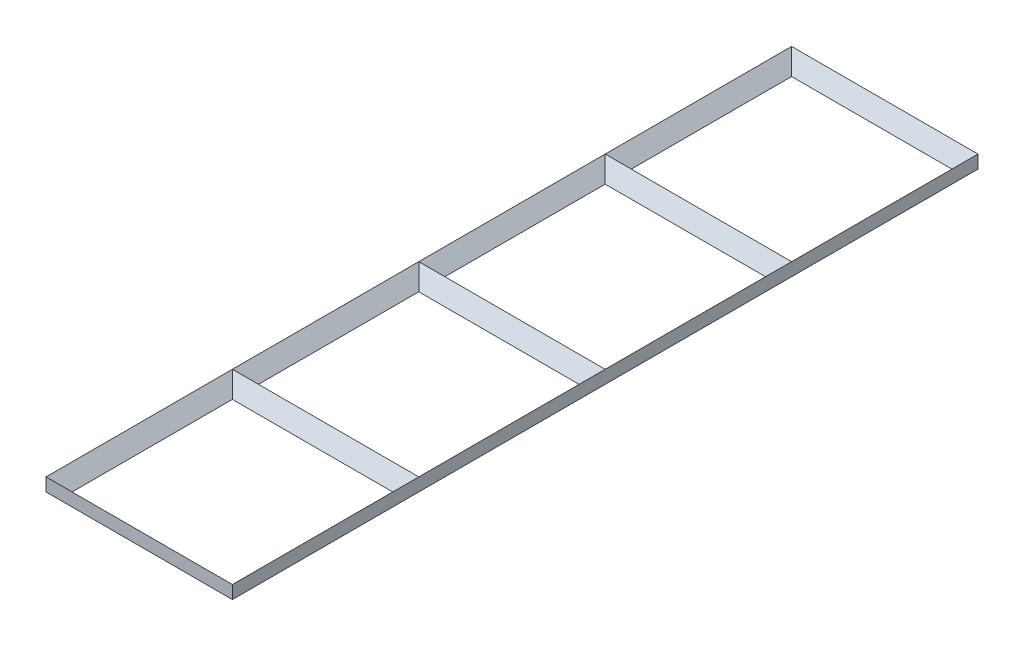
ISO-10303-21;
HEADER;
FILE_DESCRIPTION(('STEP AP214'),'2;1');
FILE_NAME('part.step','',(''),(''),'','','');
FILE_SCHEMA(('AUTOMOTIVE_DESIGN { 1 0 10303 214 1 1 1 1 }'));
ENDSEC;
DATA;
#1=APPLICATION_CONTEXT('core data for automotive mechanical design processes');
#2=APPLICATION_PROTOCOL_DEFINITION('international standard','automotive_design',2000,#1);
#3=PRODUCT_CONTEXT('',#1,'mechanical');
#4=PRODUCT('Part','Part','',(#3));
#5=PRODUCT_RELATED_PRODUCT_CATEGORY('part','',(#4));
#6=PRODUCT_DEFINITION_FORMATION('','',#4);
#7=PRODUCT_DEFINITION_CONTEXT('part definition',#1,'design');
#8=PRODUCT_DEFINITION('design','',#6,#7);
#9=PRODUCT_DEFINITION_SHAPE('','',#8);
#10=(LENGTH_UNIT() NAMED_UNIT(*) SI_UNIT(.MILLI.,.METRE.));
#11=(NAMED_UNIT(*) PLANE_ANGLE_UNIT() SI_UNIT($,.RADIAN.));
#12=(NAMED_UNIT(*) SI_UNIT($,.STERADIAN.) SOLID_ANGLE_UNIT());
#13=UNCERTAINTY_MEASURE_WITH_UNIT(LENGTH_MEASURE(1.E-05),#10,'distance_accuracy_value','');
#14=(GEOMETRIC_REPRESENTATION_CONTEXT(3) GLOBAL_UNCERTAINTY_ASSIGNED_CONTEXT((#13)) GLOBAL_UNIT_ASSIGNED_CONTEXT((#10,
#11,#12)) REPRESENTATION_CONTEXT('',''));
#15=CARTESIAN_POINT('',(0.,0.,0.));
#16=DIRECTION('',(0.,0.,1.));
#17=DIRECTION('',(1.,0.,0.));
#18=AXIS2_PLACEMENT_3D('',#15,#16,#17);
#19=CARTESIAN_POINT('',(50.,3.5,50.));
#20=DIRECTION('',(1.,0.,0.));
#21=DIRECTION('',(0.,0.,-1.));
#22=AXIS2_PLACEMENT_3D('',#19,#20,#21);
#23=PLANE('',#22);
#24=DIRECTION('',(0.,0.,1.));
#25=VECTOR('',#24,1.);
#26=CARTESIAN_POINT('',(50.,0.,50.));
#27=LINE('',#26,#25);
#28=CARTESIAN_POINT('',(50.,0.,-50.));
#29=VERTEX_POINT('',#28);
#30=CARTESIAN_POINT('',(50.,0.,150.));
#31=VERTEX_POINT('',#30);
#32=EDGE_CURVE('E271',#29,#31,#27,.T.);
#33=ORIENTED_EDGE('',*,*,#32,.F.);
#34=DIRECTION('',(0.,-1.,0.));
#35=VECTOR('',#34,1.);
#36=CARTESIAN_POINT('',(50.,3.5,-50.));
#37=LINE('',#36,#35);
#38=CARTESIAN_POINT('',(50.,3.5,-50.));
#39=VERTEX_POINT('',#38);
#40=EDGE_CURVE('E180',#39,#29,#37,.T.);
#41=ORIENTED_EDGE('',*,*,#40,.F.);
#42=DIRECTION('',(0.,0.,1.));
#43=VECTOR('',#42,1.);
#44=CARTESIAN_POINT('',(50.,3.5,0.));
#45=LINE('',#44,#43);
#46=CARTESIAN_POINT('',(50.,3.5,0.));
#47=VERTEX_POINT('',#46);
#48=EDGE_CURVE('E176',#39,#47,#45,.T.);
#49=ORIENTED_EDGE('',*,*,#48,.T.);
#50=DIRECTION('',(0.,0.,1.));
#51=VECTOR('',#50,1.);
#52=CARTESIAN_POINT('',(50.,3.5,50.));
#53=LINE('',#52,#51);
#54=CARTESIAN_POINT('',(50.,3.5,50.));
#55=VERTEX_POINT('',#54);
#56=EDGE_CURVE('E48',#47,#55,#53,.T.);
#57=ORIENTED_EDGE('',*,*,#56,.T.);
#58=DIRECTION('',(0.,0.,1.));
#59=VECTOR('',#58,1.);
#60=CARTESIAN_POINT('',(50.,3.5,100.));
#61=LINE('',#60,#59);
#62=CARTESIAN_POINT('',(50.,3.5,100.));
#63=VERTEX_POINT('',#62);
#64=EDGE_CURVE('E231',#55,#63,#61,.T.);
#65=ORIENTED_EDGE('',*,*,#64,.T.);
#66=DIRECTION('',(0.,0.,1.));
#67=VECTOR('',#66,1.);
#68=CARTESIAN_POINT('',(50.,3.5,150.));
#69=LINE('',#68,#67);
#70=CARTESIAN_POINT('',(50.,3.5,150.));
#71=VERTEX_POINT('',#70);
#72=EDGE_CURVE('E194',#63,#71,#69,.T.);
#73=ORIENTED_EDGE('',*,*,#72,.T.);
#74=DIRECTION('',(0.,-1.,0.));
#75=VECTOR('',#74,1.);
#76=CARTESIAN_POINT('',(50.,3.5,150.));
#77=LINE('',#76,#75);
#78=EDGE_CURVE('E203',#71,#31,#77,.T.);
#79=ORIENTED_EDGE('',*,*,#78,.T.);
#80=EDGE_LOOP('',(#33,#41,#49,#57,#65,#73,#79));
#81=FACE_BOUND('',#80,.T.);
#82=ADVANCED_FACE('F39',(#81),#23,.T.);
#83=CARTESIAN_POINT('',(0.,3.5,50.));
#84=DIRECTION('',(-1.,0.,0.));
#85=DIRECTION('',(0.,0.,1.));
#86=AXIS2_PLACEMENT_3D('',#83,#84,#85);
#87=PLANE('',#86);
#88=DIRECTION('',(0.,0.,-1.));
#89=VECTOR('',#88,1.);
#90=CARTESIAN_POINT('',(0.,0.,50.));
#91=LINE('',#90,#89);
#92=CARTESIAN_POINT('',(0.,0.,150.));
#93=VERTEX_POINT('',#92);
#94=CARTESIAN_POINT('',(0.,0.,-50.));
#95=VERTEX_POINT('',#94);
#96=EDGE_CURVE('E42',#93,#95,#91,.T.);
#97=ORIENTED_EDGE('',*,*,#96,.F.);
#98=DIRECTION('',(0.,-1.,0.));
#99=VECTOR('',#98,1.);
#100=CARTESIAN_POINT('',(0.,3.5,150.));
#101=LINE('',#100,#99);
#102=CARTESIAN_POINT('',(0.,3.5,150.));
#103=VERTEX_POINT('',#102);
#104=EDGE_CURVE('E218',#103,#93,#101,.T.);
#105=ORIENTED_EDGE('',*,*,#104,.F.);
#106=DIRECTION('',(0.,0.,-1.));
#107=VECTOR('',#106,1.);
#108=CARTESIAN_POINT('',(0.,3.5,150.));
#109=LINE('',#108,#107);
#110=CARTESIAN_POINT('',(0.,3.5,100.));
#111=VERTEX_POINT('',#110);
#112=EDGE_CURVE('E197',#103,#111,#109,.T.);
#113=ORIENTED_EDGE('',*,*,#112,.T.);
#114=DIRECTION('',(0.,0.,-1.));
#115=VECTOR('',#114,1.);
#116=CARTESIAN_POINT('',(0.,3.5,100.));
#117=LINE('',#116,#115);
#118=CARTESIAN_POINT('',(0.,3.5,50.));
#119=VERTEX_POINT('',#118);
#120=EDGE_CURVE('E237',#111,#119,#117,.T.);
#121=ORIENTED_EDGE('',*,*,#120,.T.);
#122=DIRECTION('',(0.,0.,-1.));
#123=VECTOR('',#122,1.);
#124=CARTESIAN_POINT('',(0.,3.5,50.));
#125=LINE('',#124,#123);
#126=CARTESIAN_POINT('',(0.,3.5,0.));
#127=VERTEX_POINT('',#126);
#128=EDGE_CURVE('E11',#119,#127,#125,.T.);
#129=ORIENTED_EDGE('',*,*,#128,.T.);
#130=DIRECTION('',(0.,0.,-1.));
#131=VECTOR('',#130,1.);
#132=CARTESIAN_POINT('',(0.,3.5,0.));
#133=LINE('',#132,#131);
#134=CARTESIAN_POINT('',(0.,3.5,-50.));
#135=VERTEX_POINT('',#134);
#136=EDGE_CURVE('E150',#127,#135,#133,.T.);
#137=ORIENTED_EDGE('',*,*,#136,.T.);
#138=DIRECTION('',(0.,-1.,0.));
#139=VECTOR('',#138,1.);
#140=CARTESIAN_POINT('',(0.,3.5,-50.));
#141=LINE('',#140,#139);
#142=EDGE_CURVE('E177',#135,#95,#141,.T.);
#143=ORIENTED_EDGE('',*,*,#142,.T.);
#144=EDGE_LOOP('',(#97,#105,#113,#121,#129,#137,#143));
#145=FACE_BOUND('',#144,.T.);
#146=ADVANCED_FACE('F279',(#145),#87,.T.);
#147=CARTESIAN_POINT('',(0.,0.,50.));
#148=DIRECTION('',(0.,1.,0.));
#149=DIRECTION('',(0.,0.,1.));
#150=AXIS2_PLACEMENT_3D('',#147,#148,#149);
#151=PLANE('',#150);
#152=DIRECTION('',(1.,0.,0.));
#153=VECTOR('',#152,1.);
#154=CARTESIAN_POINT('',(0.,0.,46.5));
#155=LINE('',#154,#153);
#156=CARTESIAN_POINT('',(3.5,0.,46.5));
#157=VERTEX_POINT('',#156);
#158=CARTESIAN_POINT('',(46.5,0.,46.5));
#159=VERTEX_POINT('',#158);
#160=EDGE_CURVE('E254',#157,#159,#155,.T.);
#161=ORIENTED_EDGE('',*,*,#160,.T.);
#162=DIRECTION('',(0.,0.,1.));
#163=VECTOR('',#162,1.);
#164=CARTESIAN_POINT('',(46.5,0.,50.));
#165=LINE('',#164,#163);
#166=CARTESIAN_POINT('',(46.5,0.,3.5));
#167=VERTEX_POINT('',#166);
#168=EDGE_CURVE('E269',#167,#159,#165,.T.);
#169=ORIENTED_EDGE('',*,*,#168,.F.);
#170=DIRECTION('',(1.,0.,0.));
#171=VECTOR('',#170,1.);
#172=CARTESIAN_POINT('',(0.,0.,3.5));
#173=LINE('',#172,#171);
#174=CARTESIAN_POINT('',(3.5,0.,3.5));
#175=VERTEX_POINT('',#174);
#176=EDGE_CURVE('E266',#175,#167,#173,.T.);
#177=ORIENTED_EDGE('',*,*,#176,.F.);
#178=DIRECTION('',(0.,0.,-1.));
#179=VECTOR('',#178,1.);
#180=CARTESIAN_POINT('',(3.5,0.,50.));
#181=LINE('',#180,#179);
#182=EDGE_CURVE('E264',#157,#175,#181,.T.);
#183=ORIENTED_EDGE('',*,*,#182,.F.);
#184=EDGE_LOOP('',(#161,#169,#177,#183));
#185=FACE_BOUND('',#184,.T.);
#186=ORIENTED_EDGE('',*,*,#32,.T.);
#187=DIRECTION('',(1.,0.,0.));
#188=VECTOR('',#187,1.);
#189=CARTESIAN_POINT('',(0.,0.,150.));
#190=LINE('',#189,#188);
#191=EDGE_CURVE('E198',#93,#31,#190,.T.);
#192=ORIENTED_EDGE('',*,*,#191,.F.);
#193=ORIENTED_EDGE('',*,*,#96,.T.);
#194=DIRECTION('',(1.,0.,0.));
#195=VECTOR('',#194,1.);
#196=CARTESIAN_POINT('',(0.,0.,-50.));
#197=LINE('',#196,#195);
#198=EDGE_CURVE('E173',#95,#29,#197,.T.);
#199=ORIENTED_EDGE('',*,*,#198,.T.);
#200=EDGE_LOOP('',(#186,#192,#193,#199));
#201=FACE_BOUND('',#200,.T.);
#202=DIRECTION('',(1.,0.,0.));
#203=VECTOR('',#202,1.);
#204=CARTESIAN_POINT('',(0.,0.,96.5));
#205=LINE('',#204,#203);
#206=CARTESIAN_POINT('',(3.5,0.,96.5));
#207=VERTEX_POINT('',#206);
#208=CARTESIAN_POINT('',(46.5,0.,96.5));
#209=VERTEX_POINT('',#208);
#210=EDGE_CURVE('E224',#207,#209,#205,.T.);
#211=ORIENTED_EDGE('',*,*,#210,.T.);
#212=DIRECTION('',(0.,0.,1.));
#213=VECTOR('',#212,1.);
#214=CARTESIAN_POINT('',(46.5,0.,100.));
#215=LINE('',#214,#213);
#216=CARTESIAN_POINT('',(46.5,0.,53.5));
#217=VERTEX_POINT('',#216);
#218=EDGE_CURVE('E235',#217,#209,#215,.T.);
#219=ORIENTED_EDGE('',*,*,#218,.F.);
#220=DIRECTION('',(1.,0.,0.));
#221=VECTOR('',#220,1.);
#222=CARTESIAN_POINT('',(0.,0.,53.5));
#223=LINE('',#222,#221);
#224=CARTESIAN_POINT('',(3.5,0.,53.5));
#225=VERTEX_POINT('',#224);
#226=EDGE_CURVE('E247',#225,#217,#223,.T.);
#227=ORIENTED_EDGE('',*,*,#226,.F.);
#228=DIRECTION('',(0.,0.,-1.));
#229=VECTOR('',#228,1.);
#230=CARTESIAN_POINT('',(3.5,0.,100.));
#231=LINE('',#230,#229);
#232=EDGE_CURVE('E245',#207,#225,#231,.T.);
#233=ORIENTED_EDGE('',*,*,#232,.F.);
#234=EDGE_LOOP('',(#211,#219,#227,#233));
#235=FACE_BOUND('',#234,.T.);
#236=DIRECTION('',(1.,0.,0.));
#237=VECTOR('',#236,1.);
#238=CARTESIAN_POINT('',(0.,0.,146.5));
#239=LINE('',#238,#237);
#240=CARTESIAN_POINT('',(3.5,0.,146.5));
#241=VERTEX_POINT('',#240);
#242=CARTESIAN_POINT('',(46.5,0.,146.5));
#243=VERTEX_POINT('',#242);
#244=EDGE_CURVE('E187',#241,#243,#239,.T.);
#245=ORIENTED_EDGE('',*,*,#244,.T.);
#246=DIRECTION('',(0.,0.,1.));
#247=VECTOR('',#246,1.);
#248=CARTESIAN_POINT('',(46.5,0.,150.));
#249=LINE('',#248,#247);
#250=CARTESIAN_POINT('',(46.5,0.,103.5));
#251=VERTEX_POINT('',#250);
#252=EDGE_CURVE('E211',#251,#243,#249,.T.);
#253=ORIENTED_EDGE('',*,*,#252,.F.);
#254=DIRECTION('',(1.,0.,0.));
#255=VECTOR('',#254,1.);
#256=CARTESIAN_POINT('',(0.,0.,103.5));
#257=LINE('',#256,#255);
#258=CARTESIAN_POINT('',(3.5,0.,103.5));
#259=VERTEX_POINT('',#258);
#260=EDGE_CURVE('E208',#259,#251,#257,.T.);
#261=ORIENTED_EDGE('',*,*,#260,.F.);
#262=DIRECTION('',(0.,0.,-1.));
#263=VECTOR('',#262,1.);
#264=CARTESIAN_POINT('',(3.5,0.,150.));
#265=LINE('',#264,#263);
#266=EDGE_CURVE('E206',#241,#259,#265,.T.);
#267=ORIENTED_EDGE('',*,*,#266,.F.);
#268=EDGE_LOOP('',(#245,#253,#261,#267));
#269=FACE_BOUND('',#268,.T.);
#270=DIRECTION('',(1.,0.,0.));
#271=VECTOR('',#270,1.);
#272=CARTESIAN_POINT('',(0.,0.,-3.5));
#273=LINE('',#272,#271);
#274=CARTESIAN_POINT('',(3.5,0.,-3.5));
#275=VERTEX_POINT('',#274);
#276=CARTESIAN_POINT('',(46.5,0.,-3.5));
#277=VERTEX_POINT('',#276);
#278=EDGE_CURVE('E153',#275,#277,#273,.T.);
#279=ORIENTED_EDGE('',*,*,#278,.T.);
#280=DIRECTION('',(0.,0.,1.));
#281=VECTOR('',#280,1.);
#282=CARTESIAN_POINT('',(46.5,0.,0.));
#283=LINE('',#282,#281);
#284=CARTESIAN_POINT('',(46.5,0.,-46.5));
#285=VERTEX_POINT('',#284);
#286=EDGE_CURVE('E168',#285,#277,#283,.T.);
#287=ORIENTED_EDGE('',*,*,#286,.F.);
#288=DIRECTION('',(1.,0.,0.));
#289=VECTOR('',#288,1.);
#290=CARTESIAN_POINT('',(0.,0.,-46.5));
#291=LINE('',#290,#289);
#292=CARTESIAN_POINT('',(3.5,0.,-46.5));
#293=VERTEX_POINT('',#292);
#294=EDGE_CURVE('E166',#293,#285,#291,.T.);
#295=ORIENTED_EDGE('',*,*,#294,.F.);
#296=DIRECTION('',(0.,0.,-1.));
#297=VECTOR('',#296,1.);
#298=CARTESIAN_POINT('',(3.5,0.,0.));
#299=LINE('',#298,#297);
#300=EDGE_CURVE('E147',#275,#293,#299,.T.);
#301=ORIENTED_EDGE('',*,*,#300,.F.);
#302=EDGE_LOOP('',(#279,#287,#295,#301));
#303=FACE_BOUND('',#302,.T.);
#304=ADVANCED_FACE('F164',(#185,#201,#235,#269,#303),#151,.F.);
#305=CARTESIAN_POINT('',(3.5,0.,50.));
#306=DIRECTION('',(-0.707106781186546,-0.707106781186549,0.));
#307=DIRECTION('',(0.707106781186549,-0.707106781186546,0.));
#308=AXIS2_PLACEMENT_3D('',#305,#306,#307);
#309=PLANE('',#308);
#310=ORIENTED_EDGE('',*,*,#182,.T.);
#311=DIRECTION('',(0.577350269189627,-0.577350269189624,0.577350269189627));
#312=VECTOR('',#311,1.);
#313=CARTESIAN_POINT('',(19.,-15.5,19.));
#314=LINE('',#313,#312);
#315=EDGE_CURVE('E242',#127,#175,#314,.T.);
#316=ORIENTED_EDGE('',*,*,#315,.F.);
#317=ORIENTED_EDGE('',*,*,#128,.F.);
#318=DIRECTION('',(-0.577350269189627,0.577350269189624,0.577350269189627));
#319=VECTOR('',#318,1.);
#320=CARTESIAN_POINT('',(2.33333333333333,1.16666666666667,47.6666666666667));
#321=LINE('',#320,#319);
#322=EDGE_CURVE('E252',#119,#157,#321,.F.);
#323=ORIENTED_EDGE('',*,*,#322,.T.);
#324=EDGE_LOOP('',(#310,#316,#317,#323));
#325=FACE_BOUND('',#324,.T.);
#326=ADVANCED_FACE('F322',(#325),#309,.F.);
#327=CARTESIAN_POINT('',(0.,0.,46.5));
#328=DIRECTION('',(0.,-0.707106781186549,0.707106781186546));
#329=DIRECTION('',(0.,-0.707106781186546,-0.707106781186549));
#330=AXIS2_PLACEMENT_3D('',#327,#328,#329);
#331=PLANE('',#330);
#332=ORIENTED_EDGE('',*,*,#160,.F.);
#333=ORIENTED_EDGE('',*,*,#322,.F.);
#334=DIRECTION('',(1.,0.,0.));
#335=VECTOR('',#334,1.);
#336=CARTESIAN_POINT('',(0.,3.5,50.));
#337=LINE('',#336,#335);
#338=EDGE_CURVE('E234',#119,#55,#337,.T.);
#339=ORIENTED_EDGE('',*,*,#338,.T.);
#340=DIRECTION('',(0.577350269189627,0.577350269189624,0.577350269189627));
#341=VECTOR('',#340,1.);
#342=CARTESIAN_POINT('',(31.,-15.5,31.));
#343=LINE('',#342,#341);
#344=EDGE_CURVE('E255',#55,#159,#343,.F.);
#345=ORIENTED_EDGE('',*,*,#344,.T.);
#346=EDGE_LOOP('',(#332,#333,#339,#345));
#347=FACE_BOUND('',#346,.T.);
#348=ADVANCED_FACE('F329',(#347),#331,.F.);
#349=CARTESIAN_POINT('',(46.5,0.,50.));
#350=DIRECTION('',(0.707106781186546,-0.707106781186549,0.));
#351=DIRECTION('',(0.707106781186549,0.707106781186546,0.));
#352=AXIS2_PLACEMENT_3D('',#349,#350,#351);
#353=PLANE('',#352);
#354=ORIENTED_EDGE('',*,*,#168,.T.);
#355=ORIENTED_EDGE('',*,*,#344,.F.);
#356=ORIENTED_EDGE('',*,*,#56,.F.);
#357=DIRECTION('',(-0.577350269189626,-0.577350269189624,0.577350269189627));
#358=VECTOR('',#357,1.);
#359=CARTESIAN_POINT('',(31.,-15.5,19.));
#360=LINE('',#359,#358);
#361=EDGE_CURVE('E258',#47,#167,#360,.T.);
#362=ORIENTED_EDGE('',*,*,#361,.T.);
#363=EDGE_LOOP('',(#354,#355,#356,#362));
#364=FACE_BOUND('',#363,.T.);
#365=ADVANCED_FACE('F374',(#364),#353,.F.);
#366=CARTESIAN_POINT('',(0.,0.,3.5));
#367=DIRECTION('',(0.,-0.707106781186549,-0.707106781186546));
#368=DIRECTION('',(0.,0.707106781186546,-0.707106781186549));
#369=AXIS2_PLACEMENT_3D('',#366,#367,#368);
#370=PLANE('',#369);
#371=ORIENTED_EDGE('',*,*,#176,.T.);
#372=ORIENTED_EDGE('',*,*,#361,.F.);
#373=DIRECTION('',(1.,0.,0.));
#374=VECTOR('',#373,1.);
#375=CARTESIAN_POINT('',(0.,3.5,0.));
#376=LINE('',#375,#374);
#377=EDGE_CURVE('E181',#127,#47,#376,.T.);
#378=ORIENTED_EDGE('',*,*,#377,.F.);
#379=ORIENTED_EDGE('',*,*,#315,.T.);
#380=EDGE_LOOP('',(#371,#372,#378,#379));
#381=FACE_BOUND('',#380,.T.);
#382=ADVANCED_FACE('F384',(#381),#370,.F.);
#383=CARTESIAN_POINT('',(3.5,0.,100.));
#384=DIRECTION('',(-0.707106781186546,-0.707106781186549,0.));
#385=DIRECTION('',(0.707106781186549,-0.707106781186546,0.));
#386=AXIS2_PLACEMENT_3D('',#383,#384,#385);
#387=PLANE('',#386);
#388=ORIENTED_EDGE('',*,*,#232,.T.);
#389=DIRECTION('',(0.577350269189627,-0.577350269189624,0.577350269189627));
#390=VECTOR('',#389,1.);
#391=CARTESIAN_POINT('',(19.,-15.5,69.));
#392=LINE('',#391,#390);
#393=EDGE_CURVE('E221',#119,#225,#392,.T.);
#394=ORIENTED_EDGE('',*,*,#393,.F.);
#395=ORIENTED_EDGE('',*,*,#120,.F.);
#396=DIRECTION('',(-0.577350269189627,0.577350269189624,0.577350269189627));
#397=VECTOR('',#396,1.);
#398=CARTESIAN_POINT('',(2.33333333333333,1.16666666666667,97.6666666666667));
#399=LINE('',#398,#397);
#400=EDGE_CURVE('E222',#111,#207,#399,.F.);
#401=ORIENTED_EDGE('',*,*,#400,.T.);
#402=EDGE_LOOP('',(#388,#394,#395,#401));
#403=FACE_BOUND('',#402,.T.);
#404=ADVANCED_FACE('F393',(#403),#387,.F.);
#405=CARTESIAN_POINT('',(0.,0.,96.5));
#406=DIRECTION('',(0.,-0.707106781186549,0.707106781186546));
#407=DIRECTION('',(0.,-0.707106781186546,-0.707106781186549));
#408=AXIS2_PLACEMENT_3D('',#405,#406,#407);
#409=PLANE('',#408);
#410=ORIENTED_EDGE('',*,*,#210,.F.);
#411=ORIENTED_EDGE('',*,*,#400,.F.);
#412=DIRECTION('',(1.,0.,0.));
#413=VECTOR('',#412,1.);
#414=CARTESIAN_POINT('',(0.,3.5,100.));
#415=LINE('',#414,#413);
#416=EDGE_CURVE('E240',#111,#63,#415,.T.);
#417=ORIENTED_EDGE('',*,*,#416,.T.);
#418=DIRECTION('',(0.577350269189627,0.577350269189624,0.577350269189627));
#419=VECTOR('',#418,1.);
#420=CARTESIAN_POINT('',(31.,-15.5,81.));
#421=LINE('',#420,#419);
#422=EDGE_CURVE('E225',#63,#209,#421,.F.);
#423=ORIENTED_EDGE('',*,*,#422,.T.);
#424=EDGE_LOOP('',(#410,#411,#417,#423));
#425=FACE_BOUND('',#424,.T.);
#426=ADVANCED_FACE('F308',(#425),#409,.F.);
#427=CARTESIAN_POINT('',(46.5,0.,100.));
#428=DIRECTION('',(0.707106781186546,-0.707106781186549,0.));
#429=DIRECTION('',(0.707106781186549,0.707106781186546,0.));
#430=AXIS2_PLACEMENT_3D('',#427,#428,#429);
#431=PLANE('',#430);
#432=ORIENTED_EDGE('',*,*,#218,.T.);
#433=ORIENTED_EDGE('',*,*,#422,.F.);
#434=ORIENTED_EDGE('',*,*,#64,.F.);
#435=DIRECTION('',(-0.577350269189626,-0.577350269189624,0.577350269189627));
#436=VECTOR('',#435,1.);
#437=CARTESIAN_POINT('',(31.,-15.5,69.));
#438=LINE('',#437,#436);
#439=EDGE_CURVE('E228',#55,#217,#438,.T.);
#440=ORIENTED_EDGE('',*,*,#439,.T.);
#441=EDGE_LOOP('',(#432,#433,#434,#440));
#442=FACE_BOUND('',#441,.T.);
#443=ADVANCED_FACE('F311',(#442),#431,.F.);
#444=CARTESIAN_POINT('',(0.,0.,53.5));
#445=DIRECTION('',(0.,-0.707106781186549,-0.707106781186546));
#446=DIRECTION('',(0.,0.707106781186546,-0.707106781186549));
#447=AXIS2_PLACEMENT_3D('',#444,#445,#446);
#448=PLANE('',#447);
#449=ORIENTED_EDGE('',*,*,#226,.T.);
#450=ORIENTED_EDGE('',*,*,#439,.F.);
#451=ORIENTED_EDGE('',*,*,#338,.F.);
#452=ORIENTED_EDGE('',*,*,#393,.T.);
#453=EDGE_LOOP('',(#449,#450,#451,#452));
#454=FACE_BOUND('',#453,.T.);
#455=ADVANCED_FACE('F420',(#454),#448,.F.);
#456=CARTESIAN_POINT('',(0.,3.5,150.));
#457=DIRECTION('',(0.,0.,-1.));
#458=DIRECTION('',(-1.,0.,0.));
#459=AXIS2_PLACEMENT_3D('',#456,#457,#458);
#460=PLANE('',#459);
#461=ORIENTED_EDGE('',*,*,#191,.T.);
#462=ORIENTED_EDGE('',*,*,#78,.F.);
#463=DIRECTION('',(1.,0.,0.));
#464=VECTOR('',#463,1.);
#465=CARTESIAN_POINT('',(0.,3.5,150.));
#466=LINE('',#465,#464);
#467=EDGE_CURVE('E201',#103,#71,#466,.T.);
#468=ORIENTED_EDGE('',*,*,#467,.F.);
#469=ORIENTED_EDGE('',*,*,#104,.T.);
#470=EDGE_LOOP('',(#461,#462,#468,#469));
#471=FACE_BOUND('',#470,.T.);
#472=ADVANCED_FACE('F292',(#471),#460,.F.);
#473=CARTESIAN_POINT('',(3.5,0.,150.));
#474=DIRECTION('',(-0.707106781186546,-0.707106781186549,0.));
#475=DIRECTION('',(0.707106781186549,-0.707106781186546,0.));
#476=AXIS2_PLACEMENT_3D('',#473,#474,#475);
#477=PLANE('',#476);
#478=ORIENTED_EDGE('',*,*,#266,.T.);
#479=DIRECTION('',(0.577350269189627,-0.577350269189624,0.577350269189627));
#480=VECTOR('',#479,1.);
#481=CARTESIAN_POINT('',(19.,-15.5,119.));
#482=LINE('',#481,#480);
#483=EDGE_CURVE('E184',#111,#259,#482,.T.);
#484=ORIENTED_EDGE('',*,*,#483,.F.);
#485=ORIENTED_EDGE('',*,*,#112,.F.);
#486=DIRECTION('',(-0.577350269189627,0.577350269189624,0.577350269189627));
#487=VECTOR('',#486,1.);
#488=CARTESIAN_POINT('',(2.33333333333333,1.16666666666667,147.666666666667));
#489=LINE('',#488,#487);
#490=EDGE_CURVE('E185',#103,#241,#489,.F.);
#491=ORIENTED_EDGE('',*,*,#490,.T.);
#492=EDGE_LOOP('',(#478,#484,#485,#491));
#493=FACE_BOUND('',#492,.T.);
#494=ADVANCED_FACE('F297',(#493),#477,.F.);
#495=CARTESIAN_POINT('',(0.,0.,146.5));
#496=DIRECTION('',(0.,-0.707106781186549,0.707106781186546));
#497=DIRECTION('',(0.,-0.707106781186546,-0.707106781186549));
#498=AXIS2_PLACEMENT_3D('',#495,#496,#497);
#499=PLANE('',#498);
#500=ORIENTED_EDGE('',*,*,#244,.F.);
#501=ORIENTED_EDGE('',*,*,#490,.F.);
#502=ORIENTED_EDGE('',*,*,#467,.T.);
#503=DIRECTION('',(0.577350269189627,0.577350269189624,0.577350269189627));
#504=VECTOR('',#503,1.);
#505=CARTESIAN_POINT('',(31.,-15.5,131.));
#506=LINE('',#505,#504);
#507=EDGE_CURVE('E188',#71,#243,#506,.F.);
#508=ORIENTED_EDGE('',*,*,#507,.T.);
#509=EDGE_LOOP('',(#500,#501,#502,#508));
#510=FACE_BOUND('',#509,.T.);
#511=ADVANCED_FACE('F319',(#510),#499,.F.);
#512=CARTESIAN_POINT('',(46.5,0.,150.));
#513=DIRECTION('',(0.707106781186546,-0.707106781186549,0.));
#514=DIRECTION('',(0.707106781186549,0.707106781186546,0.));
#515=AXIS2_PLACEMENT_3D('',#512,#513,#514);
#516=PLANE('',#515);
#517=ORIENTED_EDGE('',*,*,#252,.T.);
#518=ORIENTED_EDGE('',*,*,#507,.F.);
#519=ORIENTED_EDGE('',*,*,#72,.F.);
#520=DIRECTION('',(-0.577350269189626,-0.577350269189624,0.577350269189627));
#521=VECTOR('',#520,1.);
#522=CARTESIAN_POINT('',(31.,-15.5,119.));
#523=LINE('',#522,#521);
#524=EDGE_CURVE('E191',#63,#251,#523,.T.);
#525=ORIENTED_EDGE('',*,*,#524,.T.);
#526=EDGE_LOOP('',(#517,#518,#519,#525));
#527=FACE_BOUND('',#526,.T.);
#528=ADVANCED_FACE('F316',(#527),#516,.F.);
#529=CARTESIAN_POINT('',(0.,0.,103.5));
#530=DIRECTION('',(0.,-0.707106781186549,-0.707106781186546));
#531=DIRECTION('',(0.,0.707106781186546,-0.707106781186549));
#532=AXIS2_PLACEMENT_3D('',#529,#530,#531);
#533=PLANE('',#532);
#534=ORIENTED_EDGE('',*,*,#260,.T.);
#535=ORIENTED_EDGE('',*,*,#524,.F.);
#536=ORIENTED_EDGE('',*,*,#416,.F.);
#537=ORIENTED_EDGE('',*,*,#483,.T.);
#538=EDGE_LOOP('',(#534,#535,#536,#537));
#539=FACE_BOUND('',#538,.T.);
#540=ADVANCED_FACE('F304',(#539),#533,.F.);
#541=CARTESIAN_POINT('',(0.,3.5,-50.));
#542=DIRECTION('',(0.,0.,-1.));
#543=DIRECTION('',(-1.,0.,0.));
#544=AXIS2_PLACEMENT_3D('',#541,#542,#543);
#545=PLANE('',#544);
#546=ORIENTED_EDGE('',*,*,#198,.F.);
#547=ORIENTED_EDGE('',*,*,#142,.F.);
#548=DIRECTION('',(1.,0.,0.));
#549=VECTOR('',#548,1.);
#550=CARTESIAN_POINT('',(0.,3.5,-50.));
#551=LINE('',#550,#549);
#552=EDGE_CURVE('E285',#135,#39,#551,.T.);
#553=ORIENTED_EDGE('',*,*,#552,.T.);
#554=ORIENTED_EDGE('',*,*,#40,.T.);
#555=EDGE_LOOP('',(#546,#547,#553,#554));
#556=FACE_BOUND('',#555,.T.);
#557=ADVANCED_FACE('F282',(#556),#545,.T.);
#558=CARTESIAN_POINT('',(3.5,0.,0.));
#559=DIRECTION('',(-0.707106781186546,-0.707106781186549,0.));
#560=DIRECTION('',(0.707106781186549,-0.707106781186546,0.));
#561=AXIS2_PLACEMENT_3D('',#558,#559,#560);
#562=PLANE('',#561);
#563=ORIENTED_EDGE('',*,*,#300,.T.);
#564=DIRECTION('',(0.577350269189627,-0.577350269189624,0.577350269189627));
#565=VECTOR('',#564,1.);
#566=CARTESIAN_POINT('',(19.,-15.5,-31.));
#567=LINE('',#566,#565);
#568=EDGE_CURVE('E518',#135,#293,#567,.T.);
#569=ORIENTED_EDGE('',*,*,#568,.F.);
#570=ORIENTED_EDGE('',*,*,#136,.F.);
#571=DIRECTION('',(-0.577350269189627,0.577350269189624,0.577350269189627));
#572=VECTOR('',#571,1.);
#573=CARTESIAN_POINT('',(2.33333333333333,1.16666666666667,-2.33333333333333));
#574=LINE('',#573,#572);
#575=EDGE_CURVE('E143',#127,#275,#574,.F.);
#576=ORIENTED_EDGE('',*,*,#575,.T.);
#577=EDGE_LOOP('',(#563,#569,#570,#576));
#578=FACE_BOUND('',#577,.T.);
#579=ADVANCED_FACE('F145',(#578),#562,.F.);
#580=CARTESIAN_POINT('',(0.,0.,-3.5));
#581=DIRECTION('',(0.,-0.707106781186549,0.707106781186546));
#582=DIRECTION('',(0.,-0.707106781186546,-0.707106781186549));
#583=AXIS2_PLACEMENT_3D('',#580,#581,#582);
#584=PLANE('',#583);
#585=ORIENTED_EDGE('',*,*,#278,.F.);
#586=ORIENTED_EDGE('',*,*,#575,.F.);
#587=ORIENTED_EDGE('',*,*,#377,.T.);
#588=DIRECTION('',(0.577350269189627,0.577350269189624,0.577350269189627));
#589=VECTOR('',#588,1.);
#590=CARTESIAN_POINT('',(31.,-15.5,-19.));
#591=LINE('',#590,#589);
#592=EDGE_CURVE('E154',#47,#277,#591,.F.);
#593=ORIENTED_EDGE('',*,*,#592,.T.);
#594=EDGE_LOOP('',(#585,#586,#587,#593));
#595=FACE_BOUND('',#594,.T.);
#596=ADVANCED_FACE('F157',(#595),#584,.F.);
#597=CARTESIAN_POINT('',(46.5,0.,0.));
#598=DIRECTION('',(0.707106781186546,-0.707106781186549,0.));
#599=DIRECTION('',(0.707106781186549,0.707106781186546,0.));
#600=AXIS2_PLACEMENT_3D('',#597,#598,#599);
#601=PLANE('',#600);
#602=ORIENTED_EDGE('',*,*,#286,.T.);
#603=ORIENTED_EDGE('',*,*,#592,.F.);
#604=ORIENTED_EDGE('',*,*,#48,.F.);
#605=DIRECTION('',(-0.577350269189626,-0.577350269189624,0.577350269189627));
#606=VECTOR('',#605,1.);
#607=CARTESIAN_POINT('',(31.,-15.5,-31.));
#608=LINE('',#607,#606);
#609=EDGE_CURVE('E517',#39,#285,#608,.T.);
#610=ORIENTED_EDGE('',*,*,#609,.T.);
#611=EDGE_LOOP('',(#602,#603,#604,#610));
#612=FACE_BOUND('',#611,.T.);
#613=ADVANCED_FACE('F494',(#612),#601,.F.);
#614=CARTESIAN_POINT('',(0.,0.,-46.5));
#615=DIRECTION('',(0.,-0.707106781186549,-0.707106781186546));
#616=DIRECTION('',(0.,0.707106781186546,-0.707106781186549));
#617=AXIS2_PLACEMENT_3D('',#614,#615,#616);
#618=PLANE('',#617);
#619=ORIENTED_EDGE('',*,*,#294,.T.);
#620=ORIENTED_EDGE('',*,*,#609,.F.);
#621=ORIENTED_EDGE('',*,*,#552,.F.);
#622=ORIENTED_EDGE('',*,*,#568,.T.);
#623=EDGE_LOOP('',(#619,#620,#621,#622));
#624=FACE_BOUND('',#623,.T.);
#625=ADVANCED_FACE('F503',(#624),#618,.F.);
#626=CLOSED_SHELL('',(#82,#146,#304,#326,#348,#365,#382,#404,#426,#443,#455,#472,#494,#511,#528,
#540,#557,#579,#596,#613,#625));
#627=MANIFOLD_SOLID_BREP('B2',#626);
#628=ADVANCED_BREP_SHAPE_REPRESENTATION('',(#18,#627),#14);
#629=SHAPE_DEFINITION_REPRESENTATION(#9,#628);
ENDSEC;
END-ISO-10303-21;
